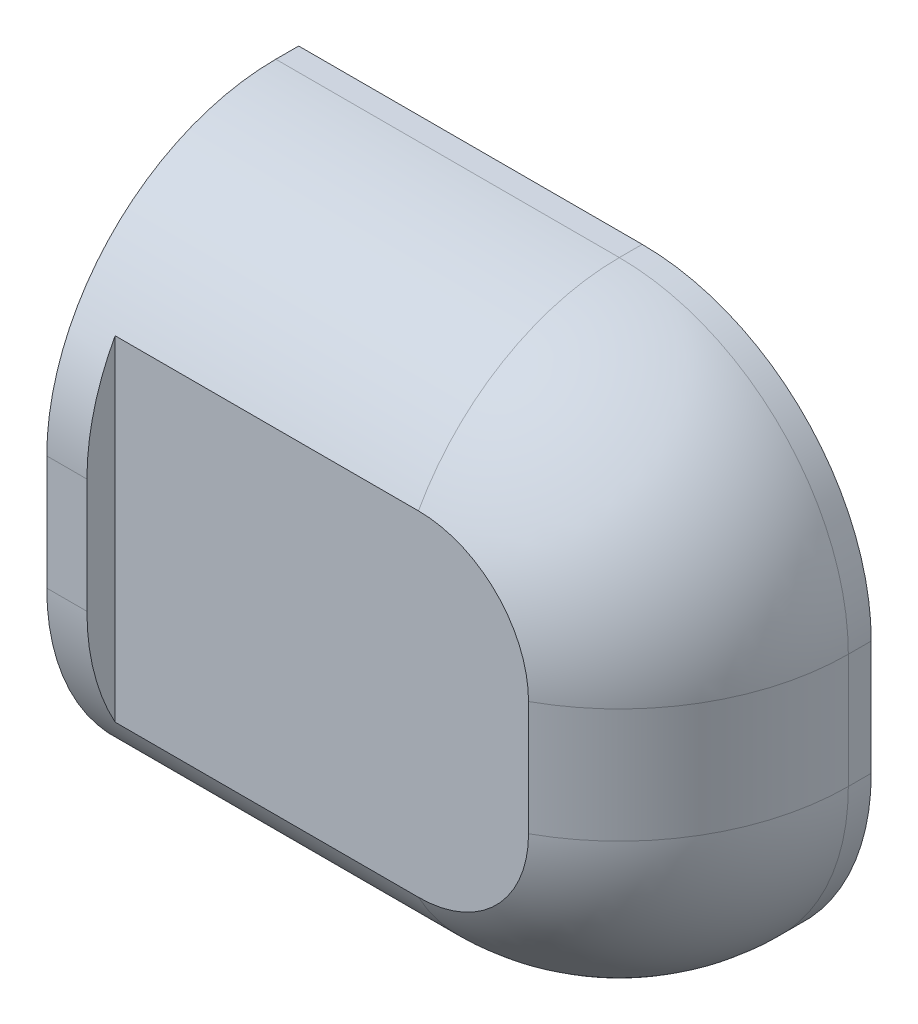
ISO-10303-21;
HEADER;
FILE_DESCRIPTION(('STEP AP214'),'2;1');
FILE_NAME('part.step','',(''),(''),'','','');
FILE_SCHEMA(('AUTOMOTIVE_DESIGN { 1 0 10303 214 1 1 1 1 }'));
ENDSEC;
DATA;
#1=APPLICATION_CONTEXT('core data for automotive mechanical design processes');
#2=APPLICATION_PROTOCOL_DEFINITION('international standard','automotive_design',2000,#1);
#3=PRODUCT_CONTEXT('',#1,'mechanical');
#4=PRODUCT('Part','Part','',(#3));
#5=PRODUCT_RELATED_PRODUCT_CATEGORY('part','',(#4));
#6=PRODUCT_DEFINITION_FORMATION('','',#4);
#7=PRODUCT_DEFINITION_CONTEXT('part definition',#1,'design');
#8=PRODUCT_DEFINITION('design','',#6,#7);
#9=PRODUCT_DEFINITION_SHAPE('','',#8);
#10=(LENGTH_UNIT() NAMED_UNIT(*) SI_UNIT(.MILLI.,.METRE.));
#11=(NAMED_UNIT(*) PLANE_ANGLE_UNIT() SI_UNIT($,.RADIAN.));
#12=(NAMED_UNIT(*) SI_UNIT($,.STERADIAN.) SOLID_ANGLE_UNIT());
#13=UNCERTAINTY_MEASURE_WITH_UNIT(LENGTH_MEASURE(1.E-05),#10,'distance_accuracy_value','');
#14=(GEOMETRIC_REPRESENTATION_CONTEXT(3) GLOBAL_UNCERTAINTY_ASSIGNED_CONTEXT((#13)) GLOBAL_UNIT_ASSIGNED_CONTEXT((#10,
#11,#12)) REPRESENTATION_CONTEXT('',''));
#15=CARTESIAN_POINT('',(0.,0.,0.));
#16=DIRECTION('',(0.,0.,1.));
#17=DIRECTION('',(1.,0.,0.));
#18=AXIS2_PLACEMENT_3D('',#15,#16,#17);
#19=CARTESIAN_POINT('',(-4.6341495500487,-3.74999995824045,6.41708997864135));
#20=DIRECTION('',(1.,0.,0.));
#21=DIRECTION('',(0.,0.,-1.));
#22=AXIS2_PLACEMENT_3D('',#19,#20,#21);
#23=PLANE('',#22);
#24=DIRECTION('',(0.,0.,-1.));
#25=VECTOR('',#24,1.);
#26=CARTESIAN_POINT('',(-4.6341495500487,-3.74999995824045,6.41708997864135));
#27=LINE('',#26,#25);
#28=CARTESIAN_POINT('',(-4.6341495500487,-3.74999995824045,3.41708997864135));
#29=VERTEX_POINT('',#28);
#30=CARTESIAN_POINT('',(-4.6341495500487,-3.74999995824045,3.11708997864135));
#31=VERTEX_POINT('',#30);
#32=EDGE_CURVE('E106',#29,#31,#27,.T.);
#33=ORIENTED_EDGE('',*,*,#32,.F.);
#34=CARTESIAN_POINT('',(-4.6341495500487,-0.749999958240449,3.41708997864135));
#35=DIRECTION('',(1.,0.,0.));
#36=DIRECTION('',(0.,0.,-1.));
#37=AXIS2_PLACEMENT_3D('',#34,#35,#36);
#38=CIRCLE('',#37,3.);
#39=CARTESIAN_POINT('',(-4.6341495500487,-0.749999958240449,6.41708997864135));
#40=VERTEX_POINT('',#39);
#41=EDGE_CURVE('E12',#29,#40,#38,.F.);
#42=ORIENTED_EDGE('',*,*,#41,.T.);
#43=DIRECTION('',(0.,-1.,0.));
#44=VECTOR('',#43,1.);
#45=CARTESIAN_POINT('',(-4.6341495500487,-3.74999995824045,6.41708997864135));
#46=LINE('',#45,#44);
#47=CARTESIAN_POINT('',(-4.6341495500487,0.750000041759552,6.41708997864135));
#48=VERTEX_POINT('',#47);
#49=EDGE_CURVE('E139',#48,#40,#46,.T.);
#50=ORIENTED_EDGE('',*,*,#49,.F.);
#51=CARTESIAN_POINT('',(-4.6341495500487,0.750000041759552,3.41708997864135));
#52=DIRECTION('',(1.,0.,0.));
#53=DIRECTION('',(0.,0.,-1.));
#54=AXIS2_PLACEMENT_3D('',#51,#52,#53);
#55=CIRCLE('',#54,3.);
#56=CARTESIAN_POINT('',(-4.6341495500487,3.75000004175955,3.41708997864135));
#57=VERTEX_POINT('',#56);
#58=EDGE_CURVE('E211',#48,#57,#55,.F.);
#59=ORIENTED_EDGE('',*,*,#58,.T.);
#60=DIRECTION('',(0.,0.,-1.));
#61=VECTOR('',#60,1.);
#62=CARTESIAN_POINT('',(-4.6341495500487,3.75000004175955,6.41708997864135));
#63=LINE('',#62,#61);
#64=CARTESIAN_POINT('',(-4.6341495500487,3.75000004175955,3.11708997864135));
#65=VERTEX_POINT('',#64);
#66=EDGE_CURVE('E116',#57,#65,#63,.T.);
#67=ORIENTED_EDGE('',*,*,#66,.T.);
#68=DIRECTION('',(0.,-1.,0.));
#69=VECTOR('',#68,1.);
#70=CARTESIAN_POINT('',(-4.6341495500487,-3.74999995824045,3.11708997864135));
#71=LINE('',#70,#69);
#72=EDGE_CURVE('E123',#65,#31,#71,.T.);
#73=ORIENTED_EDGE('',*,*,#72,.T.);
#74=EDGE_LOOP('',(#33,#42,#50,#59,#67,#73));
#75=FACE_BOUND('',#74,.T.);
#76=ADVANCED_FACE('F20',(#75),#23,.F.);
#77=CARTESIAN_POINT('',(2.8658504499513,-3.74999995824045,6.41708997864135));
#78=DIRECTION('',(0.,1.,0.));
#79=DIRECTION('',(-1.,0.,0.));
#80=AXIS2_PLACEMENT_3D('',#77,#78,#79);
#81=PLANE('',#80);
#82=DIRECTION('',(1.,0.,0.));
#83=VECTOR('',#82,1.);
#84=CARTESIAN_POINT('',(2.8658504499513,-3.74999995824045,3.11708997864135));
#85=LINE('',#84,#83);
#86=CARTESIAN_POINT('',(-0.134149550048701,-3.74999995824045,3.11708997864135));
#87=VERTEX_POINT('',#86);
#88=EDGE_CURVE('E109',#31,#87,#85,.T.);
#89=ORIENTED_EDGE('',*,*,#88,.T.);
#90=DIRECTION('',(0.,0.,-1.));
#91=VECTOR('',#90,1.);
#92=CARTESIAN_POINT('',(-0.134149550048701,-3.74999995824045,6.41708997864135));
#93=LINE('',#92,#91);
#94=CARTESIAN_POINT('',(-0.134149550048702,-3.74999995824045,3.41708997864135));
#95=VERTEX_POINT('',#94);
#96=EDGE_CURVE('E181',#87,#95,#93,.F.);
#97=ORIENTED_EDGE('',*,*,#96,.T.);
#98=DIRECTION('',(1.,0.,0.));
#99=VECTOR('',#98,1.);
#100=CARTESIAN_POINT('',(-4.6341495500487,-3.74999995824045,3.41708997864135));
#101=LINE('',#100,#99);
#102=EDGE_CURVE('E112',#95,#29,#101,.F.);
#103=ORIENTED_EDGE('',*,*,#102,.T.);
#104=ORIENTED_EDGE('',*,*,#32,.T.);
#105=EDGE_LOOP('',(#89,#97,#103,#104));
#106=FACE_BOUND('',#105,.T.);
#107=ADVANCED_FACE('F108',(#106),#81,.F.);
#108=CARTESIAN_POINT('',(2.8658504499513,-3.74999995824045,6.41708997864135));
#109=DIRECTION('',(-1.,0.,0.));
#110=DIRECTION('',(0.,0.,1.));
#111=AXIS2_PLACEMENT_3D('',#108,#109,#110);
#112=PLANE('',#111);
#113=DIRECTION('',(0.,1.,0.));
#114=VECTOR('',#113,1.);
#115=CARTESIAN_POINT('',(2.8658504499513,-3.74999995824045,3.41708997864135));
#116=LINE('',#115,#114);
#117=CARTESIAN_POINT('',(2.8658504499513,0.750000041759552,3.41708997864135));
#118=VERTEX_POINT('',#117);
#119=CARTESIAN_POINT('',(2.8658504499513,-0.749999958240448,3.41708997864135));
#120=VERTEX_POINT('',#119);
#121=EDGE_CURVE('E236',#118,#120,#116,.F.);
#122=ORIENTED_EDGE('',*,*,#121,.T.);
#123=DIRECTION('',(0.,0.,-1.));
#124=VECTOR('',#123,1.);
#125=CARTESIAN_POINT('',(2.8658504499513,-0.749999958240448,6.41708997864135));
#126=LINE('',#125,#124);
#127=CARTESIAN_POINT('',(2.8658504499513,-0.749999958240448,3.11708997864135));
#128=VERTEX_POINT('',#127);
#129=EDGE_CURVE('E172',#120,#128,#126,.T.);
#130=ORIENTED_EDGE('',*,*,#129,.T.);
#131=DIRECTION('',(0.,1.,0.));
#132=VECTOR('',#131,1.);
#133=CARTESIAN_POINT('',(2.8658504499513,-3.74999995824045,3.11708997864135));
#134=LINE('',#133,#132);
#135=CARTESIAN_POINT('',(2.8658504499513,0.750000041759552,3.11708997864135));
#136=VERTEX_POINT('',#135);
#137=EDGE_CURVE('E126',#128,#136,#134,.T.);
#138=ORIENTED_EDGE('',*,*,#137,.T.);
#139=DIRECTION('',(0.,0.,-1.));
#140=VECTOR('',#139,1.);
#141=CARTESIAN_POINT('',(2.8658504499513,0.750000041759552,6.41708997864135));
#142=LINE('',#141,#140);
#143=EDGE_CURVE('E249',#136,#118,#142,.F.);
#144=ORIENTED_EDGE('',*,*,#143,.T.);
#145=EDGE_LOOP('',(#122,#130,#138,#144));
#146=FACE_BOUND('',#145,.T.);
#147=ADVANCED_FACE('F270',(#146),#112,.F.);
#148=CARTESIAN_POINT('',(2.8658504499513,3.75000004175956,6.41708997864135));
#149=DIRECTION('',(0.,-1.,0.));
#150=DIRECTION('',(1.,0.,0.));
#151=AXIS2_PLACEMENT_3D('',#148,#149,#150);
#152=PLANE('',#151);
#153=DIRECTION('',(-1.,0.,0.));
#154=VECTOR('',#153,1.);
#155=CARTESIAN_POINT('',(-0.134149550048702,3.75000004175956,3.41708997864135));
#156=LINE('',#155,#154);
#157=CARTESIAN_POINT('',(-0.134149550048702,3.75000004175956,3.41708997864135));
#158=VERTEX_POINT('',#157);
#159=EDGE_CURVE('E224',#57,#158,#156,.F.);
#160=ORIENTED_EDGE('',*,*,#159,.T.);
#161=DIRECTION('',(0.,0.,-1.));
#162=VECTOR('',#161,1.);
#163=CARTESIAN_POINT('',(-0.134149550048702,3.75000004175956,6.41708997864135));
#164=LINE('',#163,#162);
#165=CARTESIAN_POINT('',(-0.134149550048702,3.75000004175956,3.11708997864135));
#166=VERTEX_POINT('',#165);
#167=EDGE_CURVE('E242',#158,#166,#164,.T.);
#168=ORIENTED_EDGE('',*,*,#167,.T.);
#169=DIRECTION('',(-1.,0.,0.));
#170=VECTOR('',#169,1.);
#171=CARTESIAN_POINT('',(2.8658504499513,3.75000004175956,3.11708997864135));
#172=LINE('',#171,#170);
#173=EDGE_CURVE('E228',#166,#65,#172,.T.);
#174=ORIENTED_EDGE('',*,*,#173,.T.);
#175=ORIENTED_EDGE('',*,*,#66,.F.);
#176=EDGE_LOOP('',(#160,#168,#174,#175));
#177=FACE_BOUND('',#176,.T.);
#178=ADVANCED_FACE('F226',(#177),#152,.F.);
#179=CARTESIAN_POINT('',(-0.884149550048702,4.17595509439612E-08,6.41708997864135));
#180=DIRECTION('',(0.,0.,1.));
#181=DIRECTION('',(1.,0.,0.));
#182=AXIS2_PLACEMENT_3D('',#179,#180,#181);
#183=PLANE('',#182);
#184=ORIENTED_EDGE('',*,*,#49,.T.);
#185=DIRECTION('',(1.,0.,0.));
#186=VECTOR('',#185,1.);
#187=CARTESIAN_POINT('',(-0.134149550048702,-0.749999958240448,6.41708997864135));
#188=LINE('',#187,#186);
#189=CARTESIAN_POINT('',(-4.10797910321468,-0.749999958240449,6.41708997864135));
#190=VERTEX_POINT('',#189);
#191=EDGE_CURVE('E43',#40,#190,#188,.T.);
#192=ORIENTED_EDGE('',*,*,#191,.T.);
#193=DIRECTION('',(0.,-1.,0.));
#194=VECTOR('',#193,1.);
#195=CARTESIAN_POINT('',(-4.10797910321468,-3.33384149912576,6.41708997864135));
#196=LINE('',#195,#194);
#197=CARTESIAN_POINT('',(-4.10797910321468,0.750000041759552,6.41708997864135));
#198=VERTEX_POINT('',#197);
#199=EDGE_CURVE('E136',#198,#190,#196,.T.);
#200=ORIENTED_EDGE('',*,*,#199,.F.);
#201=DIRECTION('',(-1.,0.,0.));
#202=VECTOR('',#201,1.);
#203=CARTESIAN_POINT('',(-4.6341495500487,0.750000041759552,6.41708997864135));
#204=LINE('',#203,#202);
#205=EDGE_CURVE('E206',#198,#48,#204,.T.);
#206=ORIENTED_EDGE('',*,*,#205,.T.);
#207=EDGE_LOOP('',(#184,#192,#200,#206));
#208=FACE_BOUND('',#207,.T.);
#209=ADVANCED_FACE('F220',(#208),#183,.T.);
#210=CARTESIAN_POINT('',(-0.884149550048702,4.17595509439612E-08,3.11708997864135));
#211=DIRECTION('',(0.,0.,1.));
#212=DIRECTION('',(1.,0.,0.));
#213=AXIS2_PLACEMENT_3D('',#210,#211,#212);
#214=PLANE('',#213);
#215=ORIENTED_EDGE('',*,*,#137,.F.);
#216=CARTESIAN_POINT('',(-0.134149550048702,-0.749999958240448,3.11708997864135));
#217=DIRECTION('',(0.,0.,1.));
#218=DIRECTION('',(1.,0.,0.));
#219=AXIS2_PLACEMENT_3D('',#216,#217,#218);
#220=CIRCLE('',#219,3.);
#221=EDGE_CURVE('E124',#128,#87,#220,.F.);
#222=ORIENTED_EDGE('',*,*,#221,.T.);
#223=ORIENTED_EDGE('',*,*,#88,.F.);
#224=ORIENTED_EDGE('',*,*,#72,.F.);
#225=ORIENTED_EDGE('',*,*,#173,.F.);
#226=CARTESIAN_POINT('',(-0.134149550048702,0.750000041759552,3.11708997864135));
#227=DIRECTION('',(0.,0.,1.));
#228=DIRECTION('',(1.,0.,0.));
#229=AXIS2_PLACEMENT_3D('',#226,#227,#228);
#230=CIRCLE('',#229,3.);
#231=EDGE_CURVE('E245',#166,#136,#230,.F.);
#232=ORIENTED_EDGE('',*,*,#231,.T.);
#233=EDGE_LOOP('',(#215,#222,#223,#224,#225,#232));
#234=FACE_BOUND('',#233,.T.);
#235=ADVANCED_FACE('F121',(#234),#214,.F.);
#236=CARTESIAN_POINT('',(-4.10797910321468,-3.33384149912576,6.04791797721015));
#237=DIRECTION('',(-1.,0.,0.));
#238=DIRECTION('',(0.,0.,1.));
#239=AXIS2_PLACEMENT_3D('',#236,#237,#238);
#240=PLANE('',#239);
#241=ORIENTED_EDGE('',*,*,#199,.T.);
#242=CARTESIAN_POINT('',(-4.10797910321468,-0.749999958240449,3.41708997864135));
#243=DIRECTION('',(-1.,0.,0.));
#244=DIRECTION('',(0.,0.,1.));
#245=AXIS2_PLACEMENT_3D('',#242,#243,#244);
#246=CIRCLE('',#245,3.);
#247=CARTESIAN_POINT('',(-4.10797910321468,-2.19178497756424,6.04791797721015));
#248=VERTEX_POINT('',#247);
#249=EDGE_CURVE('E30',#190,#248,#246,.F.);
#250=ORIENTED_EDGE('',*,*,#249,.T.);
#251=DIRECTION('',(0.,-1.,0.));
#252=VECTOR('',#251,1.);
#253=CARTESIAN_POINT('',(-4.10797910321468,-3.33384149912576,6.04791797721015));
#254=LINE('',#253,#252);
#255=CARTESIAN_POINT('',(-4.10797910321468,2.19178506108333,6.04791797721015));
#256=VERTEX_POINT('',#255);
#257=EDGE_CURVE('E131',#256,#248,#254,.T.);
#258=ORIENTED_EDGE('',*,*,#257,.F.);
#259=CARTESIAN_POINT('',(-4.10797910321468,0.750000041759552,3.41708997864135));
#260=DIRECTION('',(-1.,0.,0.));
#261=DIRECTION('',(0.,0.,1.));
#262=AXIS2_PLACEMENT_3D('',#259,#260,#261);
#263=CIRCLE('',#262,3.);
#264=EDGE_CURVE('E176',#256,#198,#263,.F.);
#265=ORIENTED_EDGE('',*,*,#264,.T.);
#266=EDGE_LOOP('',(#241,#250,#258,#265));
#267=FACE_BOUND('',#266,.T.);
#268=ADVANCED_FACE('F216',(#267),#240,.F.);
#269=CARTESIAN_POINT('',(-0.884149550048702,4.17595509439612E-08,6.04791797721015));
#270=DIRECTION('',(0.,0.,1.));
#271=DIRECTION('',(1.,0.,0.));
#272=AXIS2_PLACEMENT_3D('',#269,#270,#271);
#273=PLANE('',#272);
#274=DIRECTION('',(-1.,0.,0.));
#275=VECTOR('',#274,1.);
#276=CARTESIAN_POINT('',(-4.10797910321468,-2.19178497756424,6.04791797721015));
#277=LINE('',#276,#275);
#278=CARTESIAN_POINT('',(-0.134149550048702,-2.19178497756424,6.04791797721015));
#279=VERTEX_POINT('',#278);
#280=EDGE_CURVE('E184',#248,#279,#277,.F.);
#281=ORIENTED_EDGE('',*,*,#280,.T.);
#282=CARTESIAN_POINT('',(-0.134149550048702,-0.749999958240448,6.04791797721015));
#283=DIRECTION('',(0.,0.,1.));
#284=DIRECTION('',(1.,0.,0.));
#285=AXIS2_PLACEMENT_3D('',#282,#283,#284);
#286=CIRCLE('',#285,1.44178501932378);
#287=CARTESIAN_POINT('',(1.30763546927508,-0.749999958240448,6.04791797721015));
#288=VERTEX_POINT('',#287);
#289=EDGE_CURVE('E186',#279,#288,#286,.T.);
#290=ORIENTED_EDGE('',*,*,#289,.T.);
#291=DIRECTION('',(0.,-1.,0.));
#292=VECTOR('',#291,1.);
#293=CARTESIAN_POINT('',(1.30763546927508,-3.33384149912576,6.04791797721015));
#294=LINE('',#293,#292);
#295=CARTESIAN_POINT('',(1.30763546927508,0.750000041759552,6.04791797721015));
#296=VERTEX_POINT('',#295);
#297=EDGE_CURVE('E115',#288,#296,#294,.F.);
#298=ORIENTED_EDGE('',*,*,#297,.T.);
#299=CARTESIAN_POINT('',(-0.134149550048702,0.750000041759552,6.04791797721015));
#300=DIRECTION('',(0.,0.,1.));
#301=DIRECTION('',(1.,0.,0.));
#302=AXIS2_PLACEMENT_3D('',#299,#300,#301);
#303=CIRCLE('',#302,1.44178501932378);
#304=CARTESIAN_POINT('',(-0.134149550048702,2.19178506108334,6.04791797721015));
#305=VERTEX_POINT('',#304);
#306=EDGE_CURVE('E201',#296,#305,#303,.T.);
#307=ORIENTED_EDGE('',*,*,#306,.T.);
#308=DIRECTION('',(1.,0.,0.));
#309=VECTOR('',#308,1.);
#310=CARTESIAN_POINT('',(-0.134149550048702,2.19178506108334,6.04791797721015));
#311=LINE('',#310,#309);
#312=EDGE_CURVE('E207',#305,#256,#311,.F.);
#313=ORIENTED_EDGE('',*,*,#312,.T.);
#314=ORIENTED_EDGE('',*,*,#257,.T.);
#315=EDGE_LOOP('',(#281,#290,#298,#307,#313,#314));
#316=FACE_BOUND('',#315,.T.);
#317=ADVANCED_FACE('F260',(#316),#273,.T.);
#318=CARTESIAN_POINT('',(-0.134149550048702,4.17595509439612E-08,3.41708997864135));
#319=DIRECTION('',(0.,-1.,0.));
#320=DIRECTION('',(0.,0.,-1.));
#321=AXIS2_PLACEMENT_3D('',#318,#319,#320);
#322=CYLINDRICAL_SURFACE('',#321,3.);
#323=ORIENTED_EDGE('',*,*,#297,.F.);
#324=CARTESIAN_POINT('',(-0.134149550048702,-0.749999958240448,3.41708997864135));
#325=DIRECTION('',(0.,-1.,0.));
#326=DIRECTION('',(0.,0.,-1.));
#327=AXIS2_PLACEMENT_3D('',#324,#325,#326);
#328=CIRCLE('',#327,3.);
#329=EDGE_CURVE('E190',#288,#120,#328,.F.);
#330=ORIENTED_EDGE('',*,*,#329,.T.);
#331=ORIENTED_EDGE('',*,*,#121,.F.);
#332=CARTESIAN_POINT('',(-0.134149550048702,0.750000041759552,3.41708997864135));
#333=DIRECTION('',(0.,-1.,0.));
#334=DIRECTION('',(0.,0.,-1.));
#335=AXIS2_PLACEMENT_3D('',#332,#333,#334);
#336=CIRCLE('',#335,3.);
#337=EDGE_CURVE('E251',#118,#296,#336,.T.);
#338=ORIENTED_EDGE('',*,*,#337,.T.);
#339=EDGE_LOOP('',(#323,#330,#331,#338));
#340=FACE_BOUND('',#339,.T.);
#341=ADVANCED_FACE('F285',(#340),#322,.T.);
#342=CARTESIAN_POINT('',(-0.884149550048702,0.750000041759552,3.41708997864135));
#343=DIRECTION('',(1.,0.,0.));
#344=DIRECTION('',(0.,1.,0.));
#345=AXIS2_PLACEMENT_3D('',#342,#343,#344);
#346=CYLINDRICAL_SURFACE('',#345,3.);
#347=ORIENTED_EDGE('',*,*,#264,.F.);
#348=ORIENTED_EDGE('',*,*,#312,.F.);
#349=CARTESIAN_POINT('',(-0.134149550048702,0.750000041759552,3.41708997864135));
#350=DIRECTION('',(1.,0.,0.));
#351=DIRECTION('',(0.,1.,0.));
#352=AXIS2_PLACEMENT_3D('',#349,#350,#351);
#353=CIRCLE('',#352,3.);
#354=EDGE_CURVE('E156',#158,#305,#353,.T.);
#355=ORIENTED_EDGE('',*,*,#354,.F.);
#356=ORIENTED_EDGE('',*,*,#159,.F.);
#357=ORIENTED_EDGE('',*,*,#58,.F.);
#358=ORIENTED_EDGE('',*,*,#205,.F.);
#359=EDGE_LOOP('',(#347,#348,#355,#356,#357,#358));
#360=FACE_BOUND('',#359,.T.);
#361=ADVANCED_FACE('F222',(#360),#346,.T.);
#362=CARTESIAN_POINT('',(-0.134149550048702,0.750000041759552,3.41708997864135));
#363=DIRECTION('',(0.,-1.,0.));
#364=DIRECTION('',(1.,0.,0.));
#365=AXIS2_PLACEMENT_3D('',#362,#363,#364);
#366=SPHERICAL_SURFACE('',#365,3.);
#367=ORIENTED_EDGE('',*,*,#306,.F.);
#368=ORIENTED_EDGE('',*,*,#337,.F.);
#369=CARTESIAN_POINT('',(-0.134149550048702,0.750000041759552,3.41708997864135));
#370=DIRECTION('',(0.,0.,-1.));
#371=DIRECTION('',(-1.,0.,0.));
#372=AXIS2_PLACEMENT_3D('',#369,#370,#371);
#373=CIRCLE('',#372,3.);
#374=EDGE_CURVE('E161',#158,#118,#373,.T.);
#375=ORIENTED_EDGE('',*,*,#374,.F.);
#376=ORIENTED_EDGE('',*,*,#354,.T.);
#377=EDGE_LOOP('',(#367,#368,#375,#376));
#378=FACE_BOUND('',#377,.T.);
#379=ADVANCED_FACE('F263',(#378),#366,.T.);
#380=CARTESIAN_POINT('',(-0.134149550048702,0.750000041759552,6.41708997864135));
#381=DIRECTION('',(0.,0.,-1.));
#382=DIRECTION('',(-1.,0.,0.));
#383=AXIS2_PLACEMENT_3D('',#380,#381,#382);
#384=CYLINDRICAL_SURFACE('',#383,3.);
#385=ORIENTED_EDGE('',*,*,#374,.T.);
#386=ORIENTED_EDGE('',*,*,#143,.F.);
#387=ORIENTED_EDGE('',*,*,#231,.F.);
#388=ORIENTED_EDGE('',*,*,#167,.F.);
#389=EDGE_LOOP('',(#385,#386,#387,#388));
#390=FACE_BOUND('',#389,.T.);
#391=ADVANCED_FACE('F266',(#390),#384,.T.);
#392=CARTESIAN_POINT('',(-0.884149550048701,-0.749999958240448,3.41708997864135));
#393=DIRECTION('',(-1.,0.,0.));
#394=DIRECTION('',(0.,-1.,0.));
#395=AXIS2_PLACEMENT_3D('',#392,#393,#394);
#396=CYLINDRICAL_SURFACE('',#395,3.);
#397=CARTESIAN_POINT('',(-0.134149550048702,-0.749999958240448,3.41708997864135));
#398=DIRECTION('',(-1.,0.,0.));
#399=DIRECTION('',(0.,-1.,0.));
#400=AXIS2_PLACEMENT_3D('',#397,#398,#399);
#401=CIRCLE('',#400,3.);
#402=EDGE_CURVE('E24',#279,#95,#401,.F.);
#403=ORIENTED_EDGE('',*,*,#402,.F.);
#404=ORIENTED_EDGE('',*,*,#280,.F.);
#405=ORIENTED_EDGE('',*,*,#249,.F.);
#406=ORIENTED_EDGE('',*,*,#191,.F.);
#407=ORIENTED_EDGE('',*,*,#41,.F.);
#408=ORIENTED_EDGE('',*,*,#102,.F.);
#409=EDGE_LOOP('',(#403,#404,#405,#406,#407,#408));
#410=FACE_BOUND('',#409,.T.);
#411=ADVANCED_FACE('F22',(#410),#396,.T.);
#412=CARTESIAN_POINT('',(-0.134149550048702,-0.749999958240448,3.41708997864135));
#413=DIRECTION('',(0.,1.,0.));
#414=DIRECTION('',(-1.,0.,0.));
#415=AXIS2_PLACEMENT_3D('',#412,#413,#414);
#416=SPHERICAL_SURFACE('',#415,3.);
#417=ORIENTED_EDGE('',*,*,#289,.F.);
#418=ORIENTED_EDGE('',*,*,#402,.T.);
#419=CARTESIAN_POINT('',(-0.134149550048702,-0.749999958240448,3.41708997864135));
#420=DIRECTION('',(0.,0.,-1.));
#421=DIRECTION('',(-1.,0.,0.));
#422=AXIS2_PLACEMENT_3D('',#419,#420,#421);
#423=CIRCLE('',#422,3.);
#424=EDGE_CURVE('E196',#120,#95,#423,.T.);
#425=ORIENTED_EDGE('',*,*,#424,.F.);
#426=ORIENTED_EDGE('',*,*,#329,.F.);
#427=EDGE_LOOP('',(#417,#418,#425,#426));
#428=FACE_BOUND('',#427,.T.);
#429=ADVANCED_FACE('F280',(#428),#416,.T.);
#430=CARTESIAN_POINT('',(-0.134149550048702,-0.749999958240448,6.41708997864135));
#431=DIRECTION('',(0.,0.,-1.));
#432=DIRECTION('',(-1.,0.,0.));
#433=AXIS2_PLACEMENT_3D('',#430,#431,#432);
#434=CYLINDRICAL_SURFACE('',#433,3.);
#435=ORIENTED_EDGE('',*,*,#424,.T.);
#436=ORIENTED_EDGE('',*,*,#96,.F.);
#437=ORIENTED_EDGE('',*,*,#221,.F.);
#438=ORIENTED_EDGE('',*,*,#129,.F.);
#439=EDGE_LOOP('',(#435,#436,#437,#438));
#440=FACE_BOUND('',#439,.T.);
#441=ADVANCED_FACE('F274',(#440),#434,.T.);
#442=CLOSED_SHELL('',(#76,#107,#147,#178,#209,#235,#268,#317,#341,#361,#379,#391,#411,#429,#441));
#443=MANIFOLD_SOLID_BREP('B1',#442);
#444=ADVANCED_BREP_SHAPE_REPRESENTATION('',(#18,#443),#14);
#445=SHAPE_DEFINITION_REPRESENTATION(#9,#444);
ENDSEC;
END-ISO-10303-21;
